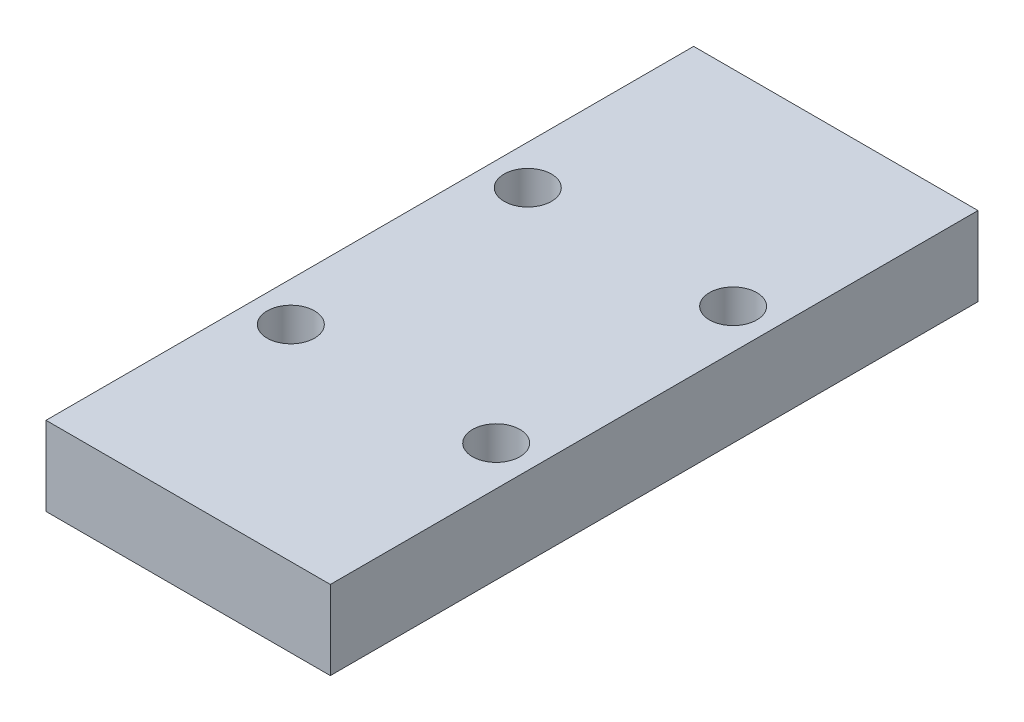
ISO-10303-21;
HEADER;
FILE_DESCRIPTION(('STEP AP214'),'2;1');
FILE_NAME('part.step','',(''),(''),'','','');
FILE_SCHEMA(('AUTOMOTIVE_DESIGN { 1 0 10303 214 1 1 1 1 }'));
ENDSEC;
DATA;
#1=APPLICATION_CONTEXT('core data for automotive mechanical design processes');
#2=APPLICATION_PROTOCOL_DEFINITION('international standard','automotive_design',2000,#1);
#3=PRODUCT_CONTEXT('',#1,'mechanical');
#4=PRODUCT('Part','Part','',(#3));
#5=PRODUCT_RELATED_PRODUCT_CATEGORY('part','',(#4));
#6=PRODUCT_DEFINITION_FORMATION('','',#4);
#7=PRODUCT_DEFINITION_CONTEXT('part definition',#1,'design');
#8=PRODUCT_DEFINITION('design','',#6,#7);
#9=PRODUCT_DEFINITION_SHAPE('','',#8);
#10=(LENGTH_UNIT() NAMED_UNIT(*) SI_UNIT(.MILLI.,.METRE.));
#11=(NAMED_UNIT(*) PLANE_ANGLE_UNIT() SI_UNIT($,.RADIAN.));
#12=(NAMED_UNIT(*) SI_UNIT($,.STERADIAN.) SOLID_ANGLE_UNIT());
#13=UNCERTAINTY_MEASURE_WITH_UNIT(LENGTH_MEASURE(1.E-05),#10,'distance_accuracy_value','');
#14=(GEOMETRIC_REPRESENTATION_CONTEXT(3) GLOBAL_UNCERTAINTY_ASSIGNED_CONTEXT((#13)) GLOBAL_UNIT_ASSIGNED_CONTEXT((#10,
#11,#12)) REPRESENTATION_CONTEXT('',''));
#15=CARTESIAN_POINT('',(0.,0.,0.));
#16=DIRECTION('',(0.,0.,1.));
#17=DIRECTION('',(1.,0.,0.));
#18=AXIS2_PLACEMENT_3D('',#15,#16,#17);
#19=CARTESIAN_POINT('',(0.,5.,0.));
#20=DIRECTION('',(0.,-1.,0.));
#21=DIRECTION('',(0.,0.,-1.));
#22=AXIS2_PLACEMENT_3D('',#19,#20,#21);
#23=PLANE('',#22);
#24=CARTESIAN_POINT('',(2.5,5.,-13.));
#25=DIRECTION('',(0.,1.,0.));
#26=DIRECTION('',(0.,0.,1.));
#27=AXIS2_PLACEMENT_3D('',#24,#25,#26);
#28=CIRCLE('',#27,1.5);
#29=CARTESIAN_POINT('',(2.5,5.,-11.5));
#30=VERTEX_POINT('',#29);
#31=EDGE_CURVE('E111',#30,#30,#28,.T.);
#32=ORIENTED_EDGE('',*,*,#31,.F.);
#33=EDGE_LOOP('',(#32));
#34=FACE_BOUND('',#33,.T.);
#35=DIRECTION('',(0.,0.,1.));
#36=VECTOR('',#35,1.);
#37=CARTESIAN_POINT('',(0.,5.,0.));
#38=LINE('',#37,#36);
#39=CARTESIAN_POINT('',(0.,5.,-41.));
#40=VERTEX_POINT('',#39);
#41=CARTESIAN_POINT('',(0.,5.,0.));
#42=VERTEX_POINT('',#41);
#43=EDGE_CURVE('E116',#40,#42,#38,.T.);
#44=ORIENTED_EDGE('',*,*,#43,.T.);
#45=DIRECTION('',(1.,0.,0.));
#46=VECTOR('',#45,1.);
#47=CARTESIAN_POINT('',(0.,5.,0.));
#48=LINE('',#47,#46);
#49=CARTESIAN_POINT('',(18.,5.,0.));
#50=VERTEX_POINT('',#49);
#51=EDGE_CURVE('E67',#42,#50,#48,.T.);
#52=ORIENTED_EDGE('',*,*,#51,.T.);
#53=DIRECTION('',(0.,0.,1.));
#54=VECTOR('',#53,1.);
#55=CARTESIAN_POINT('',(18.,5.,0.));
#56=LINE('',#55,#54);
#57=CARTESIAN_POINT('',(18.,5.,-41.));
#58=VERTEX_POINT('',#57);
#59=EDGE_CURVE('E89',#58,#50,#56,.T.);
#60=ORIENTED_EDGE('',*,*,#59,.F.);
#61=DIRECTION('',(-1.,0.,0.));
#62=VECTOR('',#61,1.);
#63=CARTESIAN_POINT('',(0.,5.,-41.));
#64=LINE('',#63,#62);
#65=EDGE_CURVE('E50',#58,#40,#64,.T.);
#66=ORIENTED_EDGE('',*,*,#65,.T.);
#67=EDGE_LOOP('',(#44,#52,#60,#66));
#68=FACE_BOUND('',#67,.T.);
#69=CARTESIAN_POINT('',(2.5,5.,-28.));
#70=DIRECTION('',(0.,1.,0.));
#71=DIRECTION('',(0.,0.,1.));
#72=AXIS2_PLACEMENT_3D('',#69,#70,#71);
#73=CIRCLE('',#72,1.5);
#74=CARTESIAN_POINT('',(2.5,5.,-26.5));
#75=VERTEX_POINT('',#74);
#76=EDGE_CURVE('E105',#75,#75,#73,.T.);
#77=ORIENTED_EDGE('',*,*,#76,.F.);
#78=EDGE_LOOP('',(#77));
#79=FACE_BOUND('',#78,.T.);
#80=CARTESIAN_POINT('',(15.5,5.,-28.));
#81=DIRECTION('',(0.,-1.,0.));
#82=DIRECTION('',(0.,0.,1.));
#83=AXIS2_PLACEMENT_3D('',#80,#81,#82);
#84=CIRCLE('',#83,1.5);
#85=CARTESIAN_POINT('',(15.5,5.,-26.5));
#86=VERTEX_POINT('',#85);
#87=EDGE_CURVE('E135',#86,#86,#84,.T.);
#88=ORIENTED_EDGE('',*,*,#87,.T.);
#89=EDGE_LOOP('',(#88));
#90=FACE_BOUND('',#89,.T.);
#91=CARTESIAN_POINT('',(15.5,5.,-13.));
#92=DIRECTION('',(0.,-1.,0.));
#93=DIRECTION('',(0.,0.,1.));
#94=AXIS2_PLACEMENT_3D('',#91,#92,#93);
#95=CIRCLE('',#94,1.5);
#96=CARTESIAN_POINT('',(15.5,5.,-11.5));
#97=VERTEX_POINT('',#96);
#98=EDGE_CURVE('E95',#97,#97,#95,.T.);
#99=ORIENTED_EDGE('',*,*,#98,.T.);
#100=EDGE_LOOP('',(#99));
#101=FACE_BOUND('',#100,.T.);
#102=ADVANCED_FACE('F33',(#34,#68,#79,#90,#101),#23,.F.);
#103=CARTESIAN_POINT('',(0.,0.,0.));
#104=DIRECTION('',(0.,-1.,0.));
#105=DIRECTION('',(0.,0.,-1.));
#106=AXIS2_PLACEMENT_3D('',#103,#104,#105);
#107=PLANE('',#106);
#108=CARTESIAN_POINT('',(2.5,0.,-13.));
#109=DIRECTION('',(0.,1.,0.));
#110=DIRECTION('',(0.,0.,1.));
#111=AXIS2_PLACEMENT_3D('',#108,#109,#110);
#112=CIRCLE('',#111,1.5);
#113=CARTESIAN_POINT('',(2.5,0.,-11.5));
#114=VERTEX_POINT('',#113);
#115=EDGE_CURVE('E108',#114,#114,#112,.T.);
#116=ORIENTED_EDGE('',*,*,#115,.T.);
#117=EDGE_LOOP('',(#116));
#118=FACE_BOUND('',#117,.T.);
#119=DIRECTION('',(0.,0.,1.));
#120=VECTOR('',#119,1.);
#121=CARTESIAN_POINT('',(0.,0.,0.));
#122=LINE('',#121,#120);
#123=CARTESIAN_POINT('',(0.,0.,-41.));
#124=VERTEX_POINT('',#123);
#125=CARTESIAN_POINT('',(0.,0.,0.));
#126=VERTEX_POINT('',#125);
#127=EDGE_CURVE('E82',#124,#126,#122,.T.);
#128=ORIENTED_EDGE('',*,*,#127,.F.);
#129=DIRECTION('',(-1.,0.,0.));
#130=VECTOR('',#129,1.);
#131=CARTESIAN_POINT('',(0.,0.,-41.));
#132=LINE('',#131,#130);
#133=CARTESIAN_POINT('',(18.,0.,-41.));
#134=VERTEX_POINT('',#133);
#135=EDGE_CURVE('E81',#134,#124,#132,.T.);
#136=ORIENTED_EDGE('',*,*,#135,.F.);
#137=DIRECTION('',(0.,0.,1.));
#138=VECTOR('',#137,1.);
#139=CARTESIAN_POINT('',(18.,0.,0.));
#140=LINE('',#139,#138);
#141=CARTESIAN_POINT('',(18.,0.,0.));
#142=VERTEX_POINT('',#141);
#143=EDGE_CURVE('E88',#134,#142,#140,.T.);
#144=ORIENTED_EDGE('',*,*,#143,.T.);
#145=DIRECTION('',(1.,0.,0.));
#146=VECTOR('',#145,1.);
#147=CARTESIAN_POINT('',(0.,0.,0.));
#148=LINE('',#147,#146);
#149=EDGE_CURVE('E62',#126,#142,#148,.T.);
#150=ORIENTED_EDGE('',*,*,#149,.F.);
#151=EDGE_LOOP('',(#128,#136,#144,#150));
#152=FACE_BOUND('',#151,.T.);
#153=CARTESIAN_POINT('',(2.5,0.,-28.));
#154=DIRECTION('',(0.,1.,0.));
#155=DIRECTION('',(0.,0.,1.));
#156=AXIS2_PLACEMENT_3D('',#153,#154,#155);
#157=CIRCLE('',#156,1.5);
#158=CARTESIAN_POINT('',(2.5,0.,-26.5));
#159=VERTEX_POINT('',#158);
#160=EDGE_CURVE('E104',#159,#159,#157,.T.);
#161=ORIENTED_EDGE('',*,*,#160,.T.);
#162=EDGE_LOOP('',(#161));
#163=FACE_BOUND('',#162,.T.);
#164=CARTESIAN_POINT('',(15.5,0.,-28.));
#165=DIRECTION('',(0.,-1.,0.));
#166=DIRECTION('',(0.,0.,1.));
#167=AXIS2_PLACEMENT_3D('',#164,#165,#166);
#168=CIRCLE('',#167,1.5);
#169=CARTESIAN_POINT('',(15.5,0.,-26.5));
#170=VERTEX_POINT('',#169);
#171=EDGE_CURVE('E146',#170,#170,#168,.T.);
#172=ORIENTED_EDGE('',*,*,#171,.F.);
#173=EDGE_LOOP('',(#172));
#174=FACE_BOUND('',#173,.T.);
#175=CARTESIAN_POINT('',(15.5,0.,-13.));
#176=DIRECTION('',(0.,-1.,0.));
#177=DIRECTION('',(0.,0.,1.));
#178=AXIS2_PLACEMENT_3D('',#175,#176,#177);
#179=CIRCLE('',#178,1.5);
#180=CARTESIAN_POINT('',(15.5,0.,-11.5));
#181=VERTEX_POINT('',#180);
#182=EDGE_CURVE('E99',#181,#181,#179,.T.);
#183=ORIENTED_EDGE('',*,*,#182,.F.);
#184=EDGE_LOOP('',(#183));
#185=FACE_BOUND('',#184,.T.);
#186=ADVANCED_FACE('F92',(#118,#152,#163,#174,#185),#107,.T.);
#187=CARTESIAN_POINT('',(0.,5.,0.));
#188=DIRECTION('',(1.,0.,0.));
#189=DIRECTION('',(0.,0.,-1.));
#190=AXIS2_PLACEMENT_3D('',#187,#188,#189);
#191=PLANE('',#190);
#192=ORIENTED_EDGE('',*,*,#127,.T.);
#193=DIRECTION('',(0.,-1.,0.));
#194=VECTOR('',#193,1.);
#195=CARTESIAN_POINT('',(0.,5.,0.));
#196=LINE('',#195,#194);
#197=EDGE_CURVE('E11',#42,#126,#196,.T.);
#198=ORIENTED_EDGE('',*,*,#197,.F.);
#199=ORIENTED_EDGE('',*,*,#43,.F.);
#200=DIRECTION('',(0.,-1.,0.));
#201=VECTOR('',#200,1.);
#202=CARTESIAN_POINT('',(0.,5.,-41.));
#203=LINE('',#202,#201);
#204=EDGE_CURVE('E42',#40,#124,#203,.T.);
#205=ORIENTED_EDGE('',*,*,#204,.T.);
#206=EDGE_LOOP('',(#192,#198,#199,#205));
#207=FACE_BOUND('',#206,.T.);
#208=ADVANCED_FACE('F35',(#207),#191,.F.);
#209=CARTESIAN_POINT('',(0.,5.,0.));
#210=DIRECTION('',(0.,0.,-1.));
#211=DIRECTION('',(-1.,0.,0.));
#212=AXIS2_PLACEMENT_3D('',#209,#210,#211);
#213=PLANE('',#212);
#214=ORIENTED_EDGE('',*,*,#149,.T.);
#215=DIRECTION('',(0.,-1.,0.));
#216=VECTOR('',#215,1.);
#217=CARTESIAN_POINT('',(18.,5.,0.));
#218=LINE('',#217,#216);
#219=EDGE_CURVE('E77',#50,#142,#218,.T.);
#220=ORIENTED_EDGE('',*,*,#219,.F.);
#221=ORIENTED_EDGE('',*,*,#51,.F.);
#222=ORIENTED_EDGE('',*,*,#197,.T.);
#223=EDGE_LOOP('',(#214,#220,#221,#222));
#224=FACE_BOUND('',#223,.T.);
#225=ADVANCED_FACE('F76',(#224),#213,.F.);
#226=CARTESIAN_POINT('',(0.,5.,-41.));
#227=DIRECTION('',(0.,0.,1.));
#228=DIRECTION('',(1.,0.,0.));
#229=AXIS2_PLACEMENT_3D('',#226,#227,#228);
#230=PLANE('',#229);
#231=ORIENTED_EDGE('',*,*,#135,.T.);
#232=ORIENTED_EDGE('',*,*,#204,.F.);
#233=ORIENTED_EDGE('',*,*,#65,.F.);
#234=DIRECTION('',(0.,-1.,0.));
#235=VECTOR('',#234,1.);
#236=CARTESIAN_POINT('',(18.,5.,-41.));
#237=LINE('',#236,#235);
#238=EDGE_CURVE('E90',#58,#134,#237,.T.);
#239=ORIENTED_EDGE('',*,*,#238,.T.);
#240=EDGE_LOOP('',(#231,#232,#233,#239));
#241=FACE_BOUND('',#240,.T.);
#242=ADVANCED_FACE('F125',(#241),#230,.F.);
#243=CARTESIAN_POINT('',(2.5,5.,-13.));
#244=DIRECTION('',(0.,-1.,0.));
#245=DIRECTION('',(0.,0.,-1.));
#246=AXIS2_PLACEMENT_3D('',#243,#244,#245);
#247=CYLINDRICAL_SURFACE('',#246,1.5);
#248=ORIENTED_EDGE('',*,*,#31,.T.);
#249=EDGE_LOOP('',(#248));
#250=FACE_BOUND('',#249,.T.);
#251=ORIENTED_EDGE('',*,*,#115,.F.);
#252=EDGE_LOOP('',(#251));
#253=FACE_BOUND('',#252,.T.);
#254=ADVANCED_FACE('F162',(#250,#253),#247,.F.);
#255=CARTESIAN_POINT('',(2.5,5.,-28.));
#256=DIRECTION('',(0.,-1.,0.));
#257=DIRECTION('',(0.,0.,-1.));
#258=AXIS2_PLACEMENT_3D('',#255,#256,#257);
#259=CYLINDRICAL_SURFACE('',#258,1.5);
#260=ORIENTED_EDGE('',*,*,#76,.T.);
#261=EDGE_LOOP('',(#260));
#262=FACE_BOUND('',#261,.T.);
#263=ORIENTED_EDGE('',*,*,#160,.F.);
#264=EDGE_LOOP('',(#263));
#265=FACE_BOUND('',#264,.T.);
#266=ADVANCED_FACE('F179',(#262,#265),#259,.F.);
#267=CARTESIAN_POINT('',(18.,5.,0.));
#268=DIRECTION('',(1.,0.,0.));
#269=DIRECTION('',(0.,0.,-1.));
#270=AXIS2_PLACEMENT_3D('',#267,#268,#269);
#271=PLANE('',#270);
#272=ORIENTED_EDGE('',*,*,#143,.F.);
#273=ORIENTED_EDGE('',*,*,#238,.F.);
#274=ORIENTED_EDGE('',*,*,#59,.T.);
#275=ORIENTED_EDGE('',*,*,#219,.T.);
#276=EDGE_LOOP('',(#272,#273,#274,#275));
#277=FACE_BOUND('',#276,.T.);
#278=ADVANCED_FACE('F86',(#277),#271,.T.);
#279=CARTESIAN_POINT('',(15.5,5.,-13.));
#280=DIRECTION('',(0.,-1.,0.));
#281=DIRECTION('',(0.,0.,-1.));
#282=AXIS2_PLACEMENT_3D('',#279,#280,#281);
#283=CYLINDRICAL_SURFACE('',#282,1.5);
#284=ORIENTED_EDGE('',*,*,#98,.F.);
#285=EDGE_LOOP('',(#284));
#286=FACE_BOUND('',#285,.T.);
#287=ORIENTED_EDGE('',*,*,#182,.T.);
#288=EDGE_LOOP('',(#287));
#289=FACE_BOUND('',#288,.T.);
#290=ADVANCED_FACE('F138',(#286,#289),#283,.F.);
#291=CARTESIAN_POINT('',(15.5,5.,-28.));
#292=DIRECTION('',(0.,-1.,0.));
#293=DIRECTION('',(0.,0.,-1.));
#294=AXIS2_PLACEMENT_3D('',#291,#292,#293);
#295=CYLINDRICAL_SURFACE('',#294,1.5);
#296=ORIENTED_EDGE('',*,*,#87,.F.);
#297=EDGE_LOOP('',(#296));
#298=FACE_BOUND('',#297,.T.);
#299=ORIENTED_EDGE('',*,*,#171,.T.);
#300=EDGE_LOOP('',(#299));
#301=FACE_BOUND('',#300,.T.);
#302=ADVANCED_FACE('F141',(#298,#301),#295,.F.);
#303=CLOSED_SHELL('',(#102,#186,#208,#225,#242,#254,#266,#278,#290,#302));
#304=MANIFOLD_SOLID_BREP('B2',#303);
#305=ADVANCED_BREP_SHAPE_REPRESENTATION('',(#18,#304),#14);
#306=SHAPE_DEFINITION_REPRESENTATION(#9,#305);
ENDSEC;
END-ISO-10303-21;
